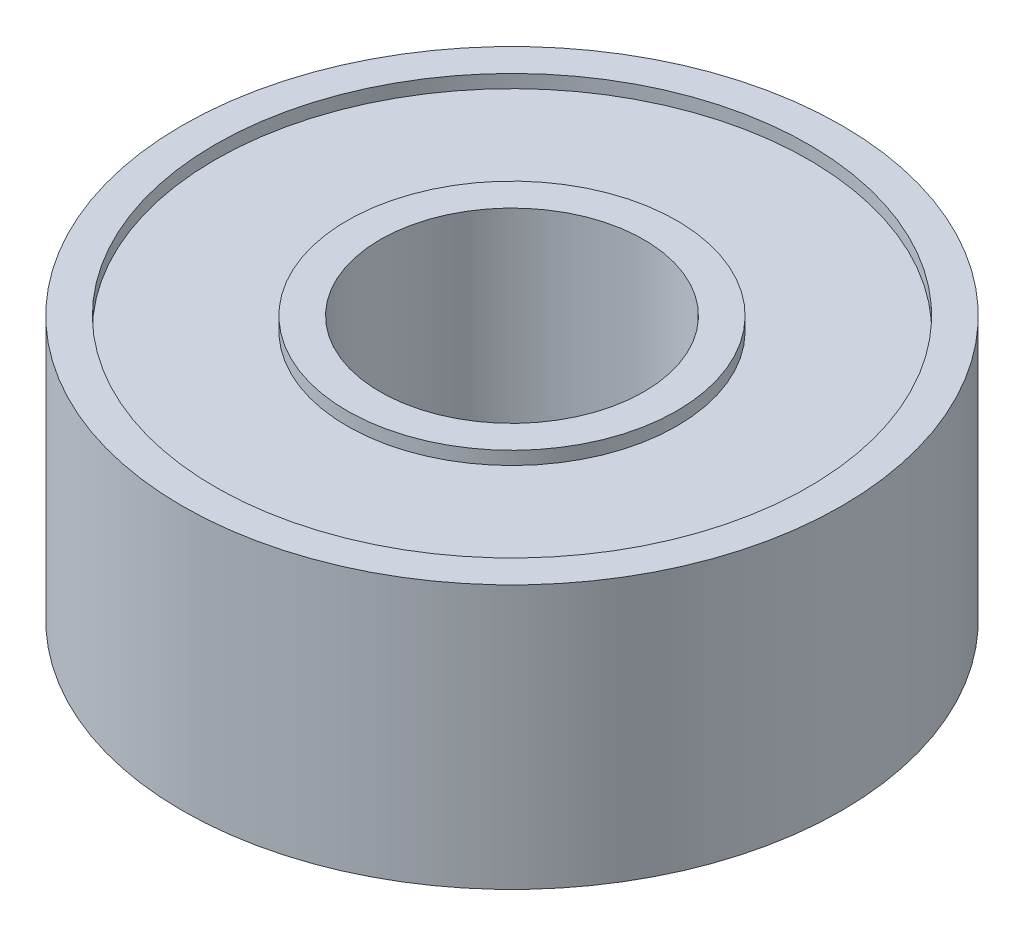
ISO-10303-21;
HEADER;
FILE_DESCRIPTION(('STEP AP214'),'2;1');
FILE_NAME('part.step','',(''),(''),'','','');
FILE_SCHEMA(('AUTOMOTIVE_DESIGN { 1 0 10303 214 1 1 1 1 }'));
ENDSEC;
DATA;
#1=APPLICATION_CONTEXT('core data for automotive mechanical design processes');
#2=APPLICATION_PROTOCOL_DEFINITION('international standard','automotive_design',2000,#1);
#3=PRODUCT_CONTEXT('',#1,'mechanical');
#4=PRODUCT('Part','Part','',(#3));
#5=PRODUCT_RELATED_PRODUCT_CATEGORY('part','',(#4));
#6=PRODUCT_DEFINITION_FORMATION('','',#4);
#7=PRODUCT_DEFINITION_CONTEXT('part definition',#1,'design');
#8=PRODUCT_DEFINITION('design','',#6,#7);
#9=PRODUCT_DEFINITION_SHAPE('','',#8);
#10=(LENGTH_UNIT() NAMED_UNIT(*) SI_UNIT(.MILLI.,.METRE.));
#11=(NAMED_UNIT(*) PLANE_ANGLE_UNIT() SI_UNIT($,.RADIAN.));
#12=(NAMED_UNIT(*) SI_UNIT($,.STERADIAN.) SOLID_ANGLE_UNIT());
#13=UNCERTAINTY_MEASURE_WITH_UNIT(LENGTH_MEASURE(1.E-05),#10,'distance_accuracy_value','');
#14=(GEOMETRIC_REPRESENTATION_CONTEXT(3) GLOBAL_UNCERTAINTY_ASSIGNED_CONTEXT((#13)) GLOBAL_UNIT_ASSIGNED_CONTEXT((#10,
#11,#12)) REPRESENTATION_CONTEXT('',''));
#15=CARTESIAN_POINT('',(0.,0.,0.));
#16=DIRECTION('',(0.,0.,1.));
#17=DIRECTION('',(1.,0.,0.));
#18=AXIS2_PLACEMENT_3D('',#15,#16,#17);
#19=CARTESIAN_POINT('',(0.,0.,0.));
#20=DIRECTION('',(0.,1.,0.));
#21=DIRECTION('',(1.,0.,0.));
#22=AXIS2_PLACEMENT_3D('',#19,#20,#21);
#23=PLANE('',#22);
#24=CARTESIAN_POINT('',(0.,0.,0.));
#25=DIRECTION('',(0.,-1.,0.));
#26=DIRECTION('',(1.,0.,0.));
#27=AXIS2_PLACEMENT_3D('',#24,#25,#26);
#28=CIRCLE('',#27,2.);
#29=CARTESIAN_POINT('',(-2.,0.,0.));
#30=VERTEX_POINT('',#29);
#31=EDGE_CURVE('E25',#30,#30,#28,.T.);
#32=ORIENTED_EDGE('',*,*,#31,.F.);
#33=EDGE_LOOP('',(#32));
#34=FACE_BOUND('',#33,.T.);
#35=CARTESIAN_POINT('',(0.,0.,0.));
#36=DIRECTION('',(0.,-1.,0.));
#37=DIRECTION('',(-1.,0.,0.));
#38=AXIS2_PLACEMENT_3D('',#35,#36,#37);
#39=CIRCLE('',#38,2.5);
#40=CARTESIAN_POINT('',(2.5,0.,0.));
#41=VERTEX_POINT('',#40);
#42=EDGE_CURVE('E193',#41,#41,#39,.T.);
#43=ORIENTED_EDGE('',*,*,#42,.T.);
#44=EDGE_LOOP('',(#43));
#45=FACE_BOUND('',#44,.T.);
#46=ADVANCED_FACE('F16',(#34,#45),#23,.F.);
#47=CARTESIAN_POINT('',(0.,4.,0.));
#48=DIRECTION('',(0.,1.,0.));
#49=DIRECTION('',(1.,0.,0.));
#50=AXIS2_PLACEMENT_3D('',#47,#48,#49);
#51=PLANE('',#50);
#52=CARTESIAN_POINT('',(0.,4.,0.));
#53=DIRECTION('',(0.,-1.,0.));
#54=DIRECTION('',(1.,0.,0.));
#55=AXIS2_PLACEMENT_3D('',#52,#53,#54);
#56=CIRCLE('',#55,2.);
#57=CARTESIAN_POINT('',(-2.,4.,0.));
#58=VERTEX_POINT('',#57);
#59=EDGE_CURVE('E111',#58,#58,#56,.T.);
#60=ORIENTED_EDGE('',*,*,#59,.T.);
#61=EDGE_LOOP('',(#60));
#62=FACE_BOUND('',#61,.T.);
#63=CARTESIAN_POINT('',(0.,4.,0.));
#64=DIRECTION('',(0.,1.,0.));
#65=DIRECTION('',(-1.,0.,0.));
#66=AXIS2_PLACEMENT_3D('',#63,#64,#65);
#67=CIRCLE('',#66,2.5);
#68=CARTESIAN_POINT('',(2.5,4.,0.));
#69=VERTEX_POINT('',#68);
#70=EDGE_CURVE('E102',#69,#69,#67,.T.);
#71=ORIENTED_EDGE('',*,*,#70,.T.);
#72=EDGE_LOOP('',(#71));
#73=FACE_BOUND('',#72,.T.);
#74=ADVANCED_FACE('F18',(#62,#73),#51,.T.);
#75=CARTESIAN_POINT('',(0.,0.,0.));
#76=DIRECTION('',(0.,1.,0.));
#77=DIRECTION('',(-1.,0.,0.));
#78=AXIS2_PLACEMENT_3D('',#75,#76,#77);
#79=CYLINDRICAL_SURFACE('',#78,5.);
#80=CARTESIAN_POINT('',(0.,4.,0.));
#81=DIRECTION('',(0.,1.,0.));
#82=DIRECTION('',(-1.,0.,0.));
#83=AXIS2_PLACEMENT_3D('',#80,#81,#82);
#84=CIRCLE('',#83,5.);
#85=CARTESIAN_POINT('',(5.,4.,0.));
#86=VERTEX_POINT('',#85);
#87=EDGE_CURVE('E109',#86,#86,#84,.T.);
#88=ORIENTED_EDGE('',*,*,#87,.F.);
#89=DIRECTION('',(0.,-1.,0.));
#90=VECTOR('',#89,1.);
#91=CARTESIAN_POINT('',(5.,0.,0.));
#92=LINE('',#91,#90);
#93=CARTESIAN_POINT('',(5.,0.,0.));
#94=VERTEX_POINT('',#93);
#95=EDGE_CURVE('E10',#86,#94,#92,.T.);
#96=ORIENTED_EDGE('',*,*,#95,.T.);
#97=CARTESIAN_POINT('',(0.,0.,0.));
#98=DIRECTION('',(0.,1.,0.));
#99=DIRECTION('',(-1.,0.,0.));
#100=AXIS2_PLACEMENT_3D('',#97,#98,#99);
#101=CIRCLE('',#100,5.);
#102=EDGE_CURVE('E173',#94,#94,#101,.T.);
#103=ORIENTED_EDGE('',*,*,#102,.T.);
#104=ORIENTED_EDGE('',*,*,#95,.F.);
#105=EDGE_LOOP('',(#88,#96,#103,#104));
#106=FACE_BOUND('',#105,.T.);
#107=ADVANCED_FACE('F225',(#106),#79,.T.);
#108=CARTESIAN_POINT('',(0.,0.,0.));
#109=DIRECTION('',(0.,1.,0.));
#110=DIRECTION('',(1.,0.,0.));
#111=AXIS2_PLACEMENT_3D('',#108,#109,#110);
#112=CYLINDRICAL_SURFACE('',#111,2.);
#113=ORIENTED_EDGE('',*,*,#59,.F.);
#114=DIRECTION('',(0.,-1.,0.));
#115=VECTOR('',#114,1.);
#116=CARTESIAN_POINT('',(-2.,0.,0.));
#117=LINE('',#116,#115);
#118=EDGE_CURVE('E41',#58,#30,#117,.T.);
#119=ORIENTED_EDGE('',*,*,#118,.T.);
#120=ORIENTED_EDGE('',*,*,#31,.T.);
#121=ORIENTED_EDGE('',*,*,#118,.F.);
#122=EDGE_LOOP('',(#113,#119,#120,#121));
#123=FACE_BOUND('',#122,.T.);
#124=ADVANCED_FACE('F230',(#123),#112,.F.);
#125=CARTESIAN_POINT('',(0.,4.,0.));
#126=DIRECTION('',(0.,1.,0.));
#127=DIRECTION('',(1.,0.,0.));
#128=AXIS2_PLACEMENT_3D('',#125,#126,#127);
#129=PLANE('',#128);
#130=CARTESIAN_POINT('',(0.,4.,0.));
#131=DIRECTION('',(0.,-1.,0.));
#132=DIRECTION('',(1.,0.,0.));
#133=AXIS2_PLACEMENT_3D('',#130,#131,#132);
#134=CIRCLE('',#133,4.5);
#135=CARTESIAN_POINT('',(-4.5,4.,0.));
#136=VERTEX_POINT('',#135);
#137=EDGE_CURVE('E92',#136,#136,#134,.T.);
#138=ORIENTED_EDGE('',*,*,#137,.T.);
#139=EDGE_LOOP('',(#138));
#140=FACE_BOUND('',#139,.T.);
#141=ORIENTED_EDGE('',*,*,#87,.T.);
#142=EDGE_LOOP('',(#141));
#143=FACE_BOUND('',#142,.T.);
#144=ADVANCED_FACE('F227',(#140,#143),#129,.T.);
#145=CARTESIAN_POINT('',(0.,3.8,0.));
#146=DIRECTION('',(0.,1.,0.));
#147=DIRECTION('',(1.,0.,0.));
#148=AXIS2_PLACEMENT_3D('',#145,#146,#147);
#149=PLANE('',#148);
#150=CARTESIAN_POINT('',(0.,3.8,0.));
#151=DIRECTION('',(0.,1.,0.));
#152=DIRECTION('',(-1.,0.,0.));
#153=AXIS2_PLACEMENT_3D('',#150,#151,#152);
#154=CIRCLE('',#153,2.5);
#155=CARTESIAN_POINT('',(2.5,3.8,0.));
#156=VERTEX_POINT('',#155);
#157=EDGE_CURVE('E85',#156,#156,#154,.T.);
#158=ORIENTED_EDGE('',*,*,#157,.F.);
#159=EDGE_LOOP('',(#158));
#160=FACE_BOUND('',#159,.T.);
#161=CARTESIAN_POINT('',(0.,3.8,0.));
#162=DIRECTION('',(0.,-1.,0.));
#163=DIRECTION('',(1.,0.,0.));
#164=AXIS2_PLACEMENT_3D('',#161,#162,#163);
#165=CIRCLE('',#164,4.5);
#166=CARTESIAN_POINT('',(-4.5,3.8,0.));
#167=VERTEX_POINT('',#166);
#168=EDGE_CURVE('E106',#167,#167,#165,.T.);
#169=ORIENTED_EDGE('',*,*,#168,.F.);
#170=EDGE_LOOP('',(#169));
#171=FACE_BOUND('',#170,.T.);
#172=ADVANCED_FACE('F229',(#160,#171),#149,.T.);
#173=CARTESIAN_POINT('',(0.,4.,0.));
#174=DIRECTION('',(0.,-1.,0.));
#175=DIRECTION('',(1.,0.,0.));
#176=AXIS2_PLACEMENT_3D('',#173,#174,#175);
#177=CYLINDRICAL_SURFACE('',#176,4.5);
#178=ORIENTED_EDGE('',*,*,#137,.F.);
#179=DIRECTION('',(0.,-1.,0.));
#180=VECTOR('',#179,1.);
#181=CARTESIAN_POINT('',(-4.5,4.,0.));
#182=LINE('',#181,#180);
#183=EDGE_CURVE('E100',#136,#167,#182,.T.);
#184=ORIENTED_EDGE('',*,*,#183,.T.);
#185=ORIENTED_EDGE('',*,*,#168,.T.);
#186=ORIENTED_EDGE('',*,*,#183,.F.);
#187=EDGE_LOOP('',(#178,#184,#185,#186));
#188=FACE_BOUND('',#187,.T.);
#189=ADVANCED_FACE('F238',(#188),#177,.F.);
#190=CARTESIAN_POINT('',(0.,4.,0.));
#191=DIRECTION('',(0.,-1.,0.));
#192=DIRECTION('',(-1.,0.,0.));
#193=AXIS2_PLACEMENT_3D('',#190,#191,#192);
#194=CYLINDRICAL_SURFACE('',#193,2.5);
#195=ORIENTED_EDGE('',*,*,#70,.F.);
#196=DIRECTION('',(0.,-1.,0.));
#197=VECTOR('',#196,1.);
#198=CARTESIAN_POINT('',(2.5,4.,0.));
#199=LINE('',#198,#197);
#200=EDGE_CURVE('E88',#69,#156,#199,.T.);
#201=ORIENTED_EDGE('',*,*,#200,.T.);
#202=ORIENTED_EDGE('',*,*,#157,.T.);
#203=ORIENTED_EDGE('',*,*,#200,.F.);
#204=EDGE_LOOP('',(#195,#201,#202,#203));
#205=FACE_BOUND('',#204,.T.);
#206=ADVANCED_FACE('F87',(#205),#194,.T.);
#207=CARTESIAN_POINT('',(0.,0.,0.));
#208=DIRECTION('',(0.,1.,0.));
#209=DIRECTION('',(1.,0.,0.));
#210=AXIS2_PLACEMENT_3D('',#207,#208,#209);
#211=PLANE('',#210);
#212=CARTESIAN_POINT('',(0.,0.,0.));
#213=DIRECTION('',(0.,1.,0.));
#214=DIRECTION('',(1.,0.,0.));
#215=AXIS2_PLACEMENT_3D('',#212,#213,#214);
#216=CIRCLE('',#215,4.5);
#217=CARTESIAN_POINT('',(-4.5,0.,0.));
#218=VERTEX_POINT('',#217);
#219=EDGE_CURVE('E157',#218,#218,#216,.T.);
#220=ORIENTED_EDGE('',*,*,#219,.T.);
#221=EDGE_LOOP('',(#220));
#222=FACE_BOUND('',#221,.T.);
#223=ORIENTED_EDGE('',*,*,#102,.F.);
#224=EDGE_LOOP('',(#223));
#225=FACE_BOUND('',#224,.T.);
#226=ADVANCED_FACE('F213',(#222,#225),#211,.F.);
#227=CARTESIAN_POINT('',(0.,0.2,0.));
#228=DIRECTION('',(0.,-1.,0.));
#229=DIRECTION('',(0.,0.,-1.));
#230=AXIS2_PLACEMENT_3D('',#227,#228,#229);
#231=PLANE('',#230);
#232=CARTESIAN_POINT('',(0.,0.2,0.));
#233=DIRECTION('',(0.,-1.,0.));
#234=DIRECTION('',(-1.,0.,0.));
#235=AXIS2_PLACEMENT_3D('',#232,#233,#234);
#236=CIRCLE('',#235,2.5);
#237=CARTESIAN_POINT('',(2.5,0.2,0.));
#238=VERTEX_POINT('',#237);
#239=EDGE_CURVE('E153',#238,#238,#236,.T.);
#240=ORIENTED_EDGE('',*,*,#239,.F.);
#241=EDGE_LOOP('',(#240));
#242=FACE_BOUND('',#241,.T.);
#243=CARTESIAN_POINT('',(0.,0.2,0.));
#244=DIRECTION('',(0.,1.,0.));
#245=DIRECTION('',(1.,0.,0.));
#246=AXIS2_PLACEMENT_3D('',#243,#244,#245);
#247=CIRCLE('',#246,4.5);
#248=CARTESIAN_POINT('',(-4.5,0.2,0.));
#249=VERTEX_POINT('',#248);
#250=EDGE_CURVE('E167',#249,#249,#247,.T.);
#251=ORIENTED_EDGE('',*,*,#250,.F.);
#252=EDGE_LOOP('',(#251));
#253=FACE_BOUND('',#252,.T.);
#254=ADVANCED_FACE('F209',(#242,#253),#231,.T.);
#255=CARTESIAN_POINT('',(0.,0.,0.));
#256=DIRECTION('',(0.,1.,0.));
#257=DIRECTION('',(1.,0.,0.));
#258=AXIS2_PLACEMENT_3D('',#255,#256,#257);
#259=CYLINDRICAL_SURFACE('',#258,4.5);
#260=ORIENTED_EDGE('',*,*,#219,.F.);
#261=DIRECTION('',(0.,1.,0.));
#262=VECTOR('',#261,1.);
#263=CARTESIAN_POINT('',(-4.5,0.,0.));
#264=LINE('',#263,#262);
#265=EDGE_CURVE('E161',#218,#249,#264,.T.);
#266=ORIENTED_EDGE('',*,*,#265,.T.);
#267=ORIENTED_EDGE('',*,*,#250,.T.);
#268=ORIENTED_EDGE('',*,*,#265,.F.);
#269=EDGE_LOOP('',(#260,#266,#267,#268));
#270=FACE_BOUND('',#269,.T.);
#271=ADVANCED_FACE('F212',(#270),#259,.F.);
#272=CARTESIAN_POINT('',(0.,0.,0.));
#273=DIRECTION('',(0.,1.,0.));
#274=DIRECTION('',(-1.,0.,0.));
#275=AXIS2_PLACEMENT_3D('',#272,#273,#274);
#276=CYLINDRICAL_SURFACE('',#275,2.5);
#277=ORIENTED_EDGE('',*,*,#42,.F.);
#278=DIRECTION('',(0.,1.,0.));
#279=VECTOR('',#278,1.);
#280=CARTESIAN_POINT('',(2.5,0.,0.));
#281=LINE('',#280,#279);
#282=EDGE_CURVE('E188',#41,#238,#281,.T.);
#283=ORIENTED_EDGE('',*,*,#282,.T.);
#284=ORIENTED_EDGE('',*,*,#239,.T.);
#285=ORIENTED_EDGE('',*,*,#282,.F.);
#286=EDGE_LOOP('',(#277,#283,#284,#285));
#287=FACE_BOUND('',#286,.T.);
#288=ADVANCED_FACE('F207',(#287),#276,.T.);
#289=CLOSED_SHELL('',(#46,#74,#107,#124,#144,#172,#189,#206,#226,#254,#271,#288));
#290=MANIFOLD_SOLID_BREP('B1',#289);
#291=ADVANCED_BREP_SHAPE_REPRESENTATION('',(#18,#290),#14);
#292=SHAPE_DEFINITION_REPRESENTATION(#9,#291);
ENDSEC;
END-ISO-10303-21;
